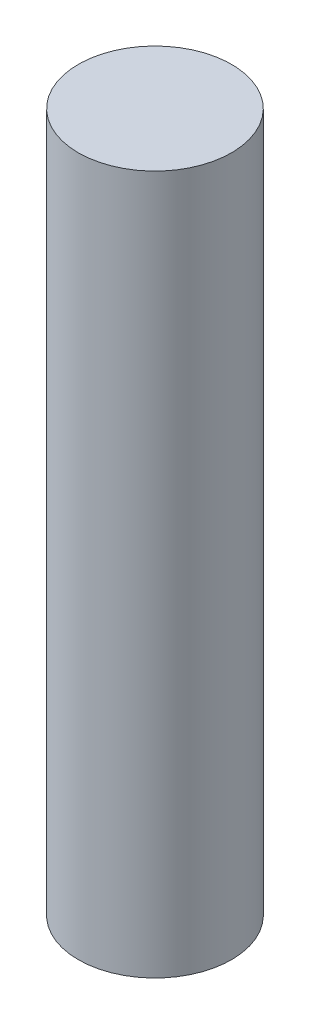
ISO-10303-21;
HEADER;
FILE_DESCRIPTION(('STEP AP214'),'2;1');
FILE_NAME('part.step','',(''),(''),'','','');
FILE_SCHEMA(('AUTOMOTIVE_DESIGN { 1 0 10303 214 1 1 1 1 }'));
ENDSEC;
DATA;
#1=APPLICATION_CONTEXT('core data for automotive mechanical design processes');
#2=APPLICATION_PROTOCOL_DEFINITION('international standard','automotive_design',2000,#1);
#3=PRODUCT_CONTEXT('',#1,'mechanical');
#4=PRODUCT('Part','Part','',(#3));
#5=PRODUCT_RELATED_PRODUCT_CATEGORY('part','',(#4));
#6=PRODUCT_DEFINITION_FORMATION('','',#4);
#7=PRODUCT_DEFINITION_CONTEXT('part definition',#1,'design');
#8=PRODUCT_DEFINITION('design','',#6,#7);
#9=PRODUCT_DEFINITION_SHAPE('','',#8);
#10=(LENGTH_UNIT() NAMED_UNIT(*) SI_UNIT(.MILLI.,.METRE.));
#11=(NAMED_UNIT(*) PLANE_ANGLE_UNIT() SI_UNIT($,.RADIAN.));
#12=(NAMED_UNIT(*) SI_UNIT($,.STERADIAN.) SOLID_ANGLE_UNIT());
#13=UNCERTAINTY_MEASURE_WITH_UNIT(LENGTH_MEASURE(1.E-05),#10,'distance_accuracy_value','');
#14=(GEOMETRIC_REPRESENTATION_CONTEXT(3) GLOBAL_UNCERTAINTY_ASSIGNED_CONTEXT((#13)) GLOBAL_UNIT_ASSIGNED_CONTEXT((#10,
#11,#12)) REPRESENTATION_CONTEXT('',''));
#15=CARTESIAN_POINT('',(0.,0.,0.));
#16=DIRECTION('',(0.,0.,1.));
#17=DIRECTION('',(1.,0.,0.));
#18=AXIS2_PLACEMENT_3D('',#15,#16,#17);
#19=CARTESIAN_POINT('',(0.,463.296,0.));
#20=DIRECTION('',(0.,-1.,0.));
#21=DIRECTION('',(0.,0.,-1.));
#22=AXIS2_PLACEMENT_3D('',#19,#20,#21);
#23=CYLINDRICAL_SURFACE('',#22,50.8);
#24=CARTESIAN_POINT('',(0.,463.296,0.));
#25=DIRECTION('',(0.,1.,0.));
#26=DIRECTION('',(0.,0.,1.));
#27=AXIS2_PLACEMENT_3D('',#24,#25,#26);
#28=CIRCLE('',#27,50.8);
#29=CARTESIAN_POINT('',(0.,463.296,50.8));
#30=VERTEX_POINT('',#29);
#31=EDGE_CURVE('E10',#30,#30,#28,.T.);
#32=ORIENTED_EDGE('',*,*,#31,.F.);
#33=EDGE_LOOP('',(#32));
#34=FACE_BOUND('',#33,.T.);
#35=CARTESIAN_POINT('',(0.,0.,0.));
#36=DIRECTION('',(0.,1.,0.));
#37=DIRECTION('',(0.,0.,1.));
#38=AXIS2_PLACEMENT_3D('',#35,#36,#37);
#39=CIRCLE('',#38,50.8);
#40=CARTESIAN_POINT('',(0.,0.,50.8));
#41=VERTEX_POINT('',#40);
#42=EDGE_CURVE('E34',#41,#41,#39,.T.);
#43=ORIENTED_EDGE('',*,*,#42,.T.);
#44=EDGE_LOOP('',(#43));
#45=FACE_BOUND('',#44,.T.);
#46=ADVANCED_FACE('F31',(#34,#45),#23,.T.);
#47=CARTESIAN_POINT('',(0.,463.296,0.));
#48=DIRECTION('',(0.,1.,0.));
#49=DIRECTION('',(0.,0.,1.));
#50=AXIS2_PLACEMENT_3D('',#47,#48,#49);
#51=PLANE('',#50);
#52=ORIENTED_EDGE('',*,*,#31,.T.);
#53=EDGE_LOOP('',(#52));
#54=FACE_BOUND('',#53,.T.);
#55=ADVANCED_FACE('F46',(#54),#51,.T.);
#56=CARTESIAN_POINT('',(0.,0.,0.));
#57=DIRECTION('',(0.,1.,0.));
#58=DIRECTION('',(0.,0.,1.));
#59=AXIS2_PLACEMENT_3D('',#56,#57,#58);
#60=PLANE('',#59);
#61=ORIENTED_EDGE('',*,*,#42,.F.);
#62=EDGE_LOOP('',(#61));
#63=FACE_BOUND('',#62,.T.);
#64=ADVANCED_FACE('F44',(#63),#60,.F.);
#65=CLOSED_SHELL('',(#46,#55,#64));
#66=MANIFOLD_SOLID_BREP('B2',#65);
#67=ADVANCED_BREP_SHAPE_REPRESENTATION('',(#18,#66),#14);
#68=SHAPE_DEFINITION_REPRESENTATION(#9,#67);
ENDSEC;
END-ISO-10303-21;
